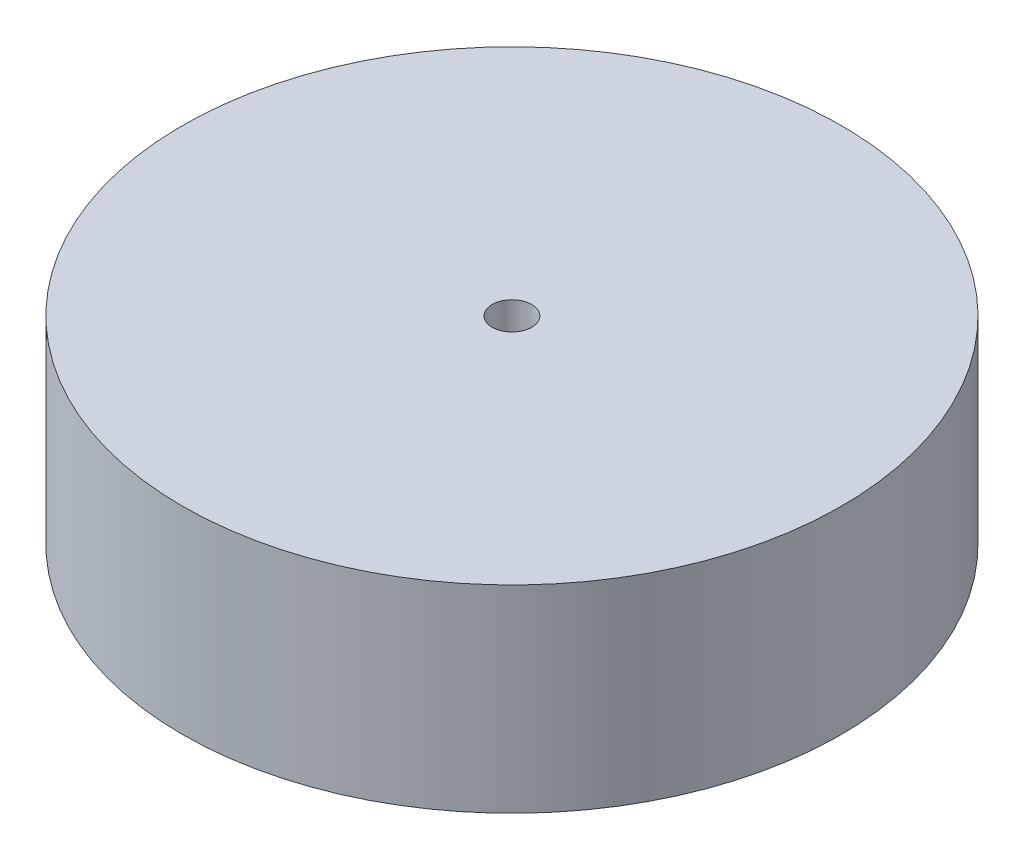
ISO-10303-21;
HEADER;
FILE_DESCRIPTION(('STEP AP214'),'2;1');
FILE_NAME('part.step','',(''),(''),'','','');
FILE_SCHEMA(('AUTOMOTIVE_DESIGN { 1 0 10303 214 1 1 1 1 }'));
ENDSEC;
DATA;
#1=APPLICATION_CONTEXT('core data for automotive mechanical design processes');
#2=APPLICATION_PROTOCOL_DEFINITION('international standard','automotive_design',2000,#1);
#3=PRODUCT_CONTEXT('',#1,'mechanical');
#4=PRODUCT('Part','Part','',(#3));
#5=PRODUCT_RELATED_PRODUCT_CATEGORY('part','',(#4));
#6=PRODUCT_DEFINITION_FORMATION('','',#4);
#7=PRODUCT_DEFINITION_CONTEXT('part definition',#1,'design');
#8=PRODUCT_DEFINITION('design','',#6,#7);
#9=PRODUCT_DEFINITION_SHAPE('','',#8);
#10=(LENGTH_UNIT() NAMED_UNIT(*) SI_UNIT(.MILLI.,.METRE.));
#11=(NAMED_UNIT(*) PLANE_ANGLE_UNIT() SI_UNIT($,.RADIAN.));
#12=(NAMED_UNIT(*) SI_UNIT($,.STERADIAN.) SOLID_ANGLE_UNIT());
#13=UNCERTAINTY_MEASURE_WITH_UNIT(LENGTH_MEASURE(1.E-05),#10,'distance_accuracy_value','');
#14=(GEOMETRIC_REPRESENTATION_CONTEXT(3) GLOBAL_UNCERTAINTY_ASSIGNED_CONTEXT((#13)) GLOBAL_UNIT_ASSIGNED_CONTEXT((#10,
#11,#12)) REPRESENTATION_CONTEXT('',''));
#15=CARTESIAN_POINT('',(0.,0.,0.));
#16=DIRECTION('',(0.,0.,1.));
#17=DIRECTION('',(1.,0.,0.));
#18=AXIS2_PLACEMENT_3D('',#15,#16,#17);
#19=CARTESIAN_POINT('',(0.,30.,0.));
#20=DIRECTION('',(0.,1.,0.));
#21=DIRECTION('',(0.,0.,1.));
#22=AXIS2_PLACEMENT_3D('',#19,#20,#21);
#23=PLANE('',#22);
#24=CARTESIAN_POINT('',(0.,30.,0.));
#25=DIRECTION('',(0.,1.,0.));
#26=DIRECTION('',(0.,0.,1.));
#27=AXIS2_PLACEMENT_3D('',#24,#25,#26);
#28=CIRCLE('',#27,50.);
#29=CARTESIAN_POINT('',(0.,30.,50.));
#30=VERTEX_POINT('',#29);
#31=EDGE_CURVE('E10',#30,#30,#28,.T.);
#32=ORIENTED_EDGE('',*,*,#31,.T.);
#33=EDGE_LOOP('',(#32));
#34=FACE_BOUND('',#33,.T.);
#35=CARTESIAN_POINT('',(0.,30.,0.));
#36=DIRECTION('',(0.,1.,0.));
#37=DIRECTION('',(0.,0.,1.));
#38=AXIS2_PLACEMENT_3D('',#35,#36,#37);
#39=CIRCLE('',#38,3.);
#40=CARTESIAN_POINT('',(0.,30.,3.));
#41=VERTEX_POINT('',#40);
#42=EDGE_CURVE('E43',#41,#41,#39,.T.);
#43=ORIENTED_EDGE('',*,*,#42,.F.);
#44=EDGE_LOOP('',(#43));
#45=FACE_BOUND('',#44,.T.);
#46=ADVANCED_FACE('F32',(#34,#45),#23,.T.);
#47=CARTESIAN_POINT('',(0.,0.,0.));
#48=DIRECTION('',(0.,1.,0.));
#49=DIRECTION('',(0.,0.,1.));
#50=AXIS2_PLACEMENT_3D('',#47,#48,#49);
#51=PLANE('',#50);
#52=CARTESIAN_POINT('',(0.,0.,0.));
#53=DIRECTION('',(0.,1.,0.));
#54=DIRECTION('',(0.,0.,1.));
#55=AXIS2_PLACEMENT_3D('',#52,#53,#54);
#56=CIRCLE('',#55,50.);
#57=CARTESIAN_POINT('',(0.,0.,50.));
#58=VERTEX_POINT('',#57);
#59=EDGE_CURVE('E36',#58,#58,#56,.T.);
#60=ORIENTED_EDGE('',*,*,#59,.F.);
#61=EDGE_LOOP('',(#60));
#62=FACE_BOUND('',#61,.T.);
#63=CARTESIAN_POINT('',(0.,0.,0.));
#64=DIRECTION('',(0.,1.,0.));
#65=DIRECTION('',(0.,0.,1.));
#66=AXIS2_PLACEMENT_3D('',#63,#64,#65);
#67=CIRCLE('',#66,3.);
#68=CARTESIAN_POINT('',(0.,0.,3.));
#69=VERTEX_POINT('',#68);
#70=EDGE_CURVE('E45',#69,#69,#67,.T.);
#71=ORIENTED_EDGE('',*,*,#70,.T.);
#72=EDGE_LOOP('',(#71));
#73=FACE_BOUND('',#72,.T.);
#74=ADVANCED_FACE('F55',(#62,#73),#51,.F.);
#75=CARTESIAN_POINT('',(0.,30.,0.));
#76=DIRECTION('',(0.,-1.,0.));
#77=DIRECTION('',(0.,0.,-1.));
#78=AXIS2_PLACEMENT_3D('',#75,#76,#77);
#79=CYLINDRICAL_SURFACE('',#78,50.);
#80=ORIENTED_EDGE('',*,*,#31,.F.);
#81=EDGE_LOOP('',(#80));
#82=FACE_BOUND('',#81,.T.);
#83=ORIENTED_EDGE('',*,*,#59,.T.);
#84=EDGE_LOOP('',(#83));
#85=FACE_BOUND('',#84,.T.);
#86=ADVANCED_FACE('F34',(#82,#85),#79,.T.);
#87=CARTESIAN_POINT('',(0.,30.,0.));
#88=DIRECTION('',(0.,-1.,0.));
#89=DIRECTION('',(0.,0.,-1.));
#90=AXIS2_PLACEMENT_3D('',#87,#88,#89);
#91=CYLINDRICAL_SURFACE('',#90,3.);
#92=ORIENTED_EDGE('',*,*,#42,.T.);
#93=EDGE_LOOP('',(#92));
#94=FACE_BOUND('',#93,.T.);
#95=ORIENTED_EDGE('',*,*,#70,.F.);
#96=EDGE_LOOP('',(#95));
#97=FACE_BOUND('',#96,.T.);
#98=ADVANCED_FACE('F51',(#94,#97),#91,.F.);
#99=CLOSED_SHELL('',(#46,#74,#86,#98));
#100=MANIFOLD_SOLID_BREP('B2',#99);
#101=ADVANCED_BREP_SHAPE_REPRESENTATION('',(#18,#100),#14);
#102=SHAPE_DEFINITION_REPRESENTATION(#9,#101);
ENDSEC;
END-ISO-10303-21;
